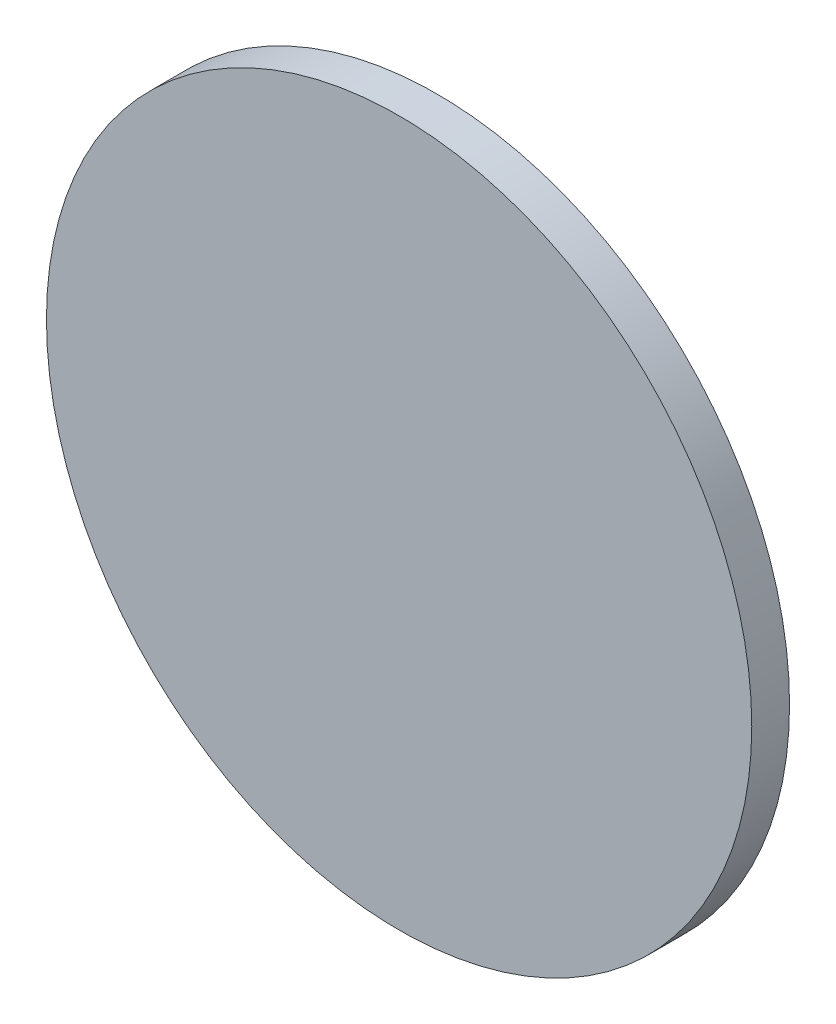
ISO-10303-21;
HEADER;
FILE_DESCRIPTION(('STEP AP214'),'2;1');
FILE_NAME('part.step','',(''),(''),'','','');
FILE_SCHEMA(('AUTOMOTIVE_DESIGN { 1 0 10303 214 1 1 1 1 }'));
ENDSEC;
DATA;
#1=APPLICATION_CONTEXT('core data for automotive mechanical design processes');
#2=APPLICATION_PROTOCOL_DEFINITION('international standard','automotive_design',2000,#1);
#3=PRODUCT_CONTEXT('',#1,'mechanical');
#4=PRODUCT('Part','Part','',(#3));
#5=PRODUCT_RELATED_PRODUCT_CATEGORY('part','',(#4));
#6=PRODUCT_DEFINITION_FORMATION('','',#4);
#7=PRODUCT_DEFINITION_CONTEXT('part definition',#1,'design');
#8=PRODUCT_DEFINITION('design','',#6,#7);
#9=PRODUCT_DEFINITION_SHAPE('','',#8);
#10=(LENGTH_UNIT() NAMED_UNIT(*) SI_UNIT(.MILLI.,.METRE.));
#11=(NAMED_UNIT(*) PLANE_ANGLE_UNIT() SI_UNIT($,.RADIAN.));
#12=(NAMED_UNIT(*) SI_UNIT($,.STERADIAN.) SOLID_ANGLE_UNIT());
#13=UNCERTAINTY_MEASURE_WITH_UNIT(LENGTH_MEASURE(1.E-05),#10,'distance_accuracy_value','');
#14=(GEOMETRIC_REPRESENTATION_CONTEXT(3) GLOBAL_UNCERTAINTY_ASSIGNED_CONTEXT((#13)) GLOBAL_UNIT_ASSIGNED_CONTEXT((#10,
#11,#12)) REPRESENTATION_CONTEXT('',''));
#15=CARTESIAN_POINT('',(0.,0.,0.));
#16=DIRECTION('',(0.,0.,1.));
#17=DIRECTION('',(1.,0.,0.));
#18=AXIS2_PLACEMENT_3D('',#15,#16,#17);
#19=CARTESIAN_POINT('',(0.,0.,19.05));
#20=DIRECTION('',(0.,0.,-1.));
#21=DIRECTION('',(-1.,0.,0.));
#22=AXIS2_PLACEMENT_3D('',#19,#20,#21);
#23=CYLINDRICAL_SURFACE('',#22,177.8);
#24=CARTESIAN_POINT('',(0.,0.,19.05));
#25=DIRECTION('',(0.,0.,1.));
#26=DIRECTION('',(1.,0.,0.));
#27=AXIS2_PLACEMENT_3D('',#24,#25,#26);
#28=CIRCLE('',#27,177.8);
#29=CARTESIAN_POINT('',(-177.8,0.,19.05));
#30=VERTEX_POINT('',#29);
#31=EDGE_CURVE('E10',#30,#30,#28,.T.);
#32=CARTESIAN_POINT('',(0.,0.,0.));
#33=DIRECTION('',(0.,0.,1.));
#34=DIRECTION('',(1.,0.,0.));
#35=AXIS2_PLACEMENT_3D('',#32,#33,#34);
#36=CIRCLE('',#35,177.8);
#37=CARTESIAN_POINT('',(-177.8,0.,0.));
#38=VERTEX_POINT('',#37);
#39=EDGE_CURVE('E35',#38,#38,#36,.T.);
#40=CARTESIAN_POINT('',(-177.8,0.,19.05));
#41=CARTESIAN_POINT('',(-177.8,0.,18.8515625));
#42=CARTESIAN_POINT('',(-177.8,0.,18.653125));
#43=CARTESIAN_POINT('',(-177.8,0.,18.25625));
#44=CARTESIAN_POINT('',(-177.8,0.,18.0578125));
#45=CARTESIAN_POINT('',(-177.8,0.,17.6609375));
#46=CARTESIAN_POINT('',(-177.8,0.,17.4625));
#47=CARTESIAN_POINT('',(-177.8,0.,17.065625));
#48=CARTESIAN_POINT('',(-177.8,0.,16.8671875));
#49=CARTESIAN_POINT('',(-177.8,0.,16.4703125));
#50=CARTESIAN_POINT('',(-177.8,0.,16.271875));
#51=CARTESIAN_POINT('',(-177.8,0.,15.875));
#52=CARTESIAN_POINT('',(-177.8,0.,15.6765625));
#53=CARTESIAN_POINT('',(-177.8,0.,15.2796875));
#54=CARTESIAN_POINT('',(-177.8,0.,15.08125));
#55=CARTESIAN_POINT('',(-177.8,0.,14.684375));
#56=CARTESIAN_POINT('',(-177.8,0.,14.4859375));
#57=CARTESIAN_POINT('',(-177.8,0.,14.0890625));
#58=CARTESIAN_POINT('',(-177.8,0.,13.890625));
#59=CARTESIAN_POINT('',(-177.8,0.,13.49375));
#60=CARTESIAN_POINT('',(-177.8,0.,13.2953125));
#61=CARTESIAN_POINT('',(-177.8,0.,12.8984375));
#62=CARTESIAN_POINT('',(-177.8,0.,12.7));
#63=CARTESIAN_POINT('',(-177.8,0.,12.303125));
#64=CARTESIAN_POINT('',(-177.8,0.,12.1046875));
#65=CARTESIAN_POINT('',(-177.8,0.,11.7078125));
#66=CARTESIAN_POINT('',(-177.8,0.,11.509375));
#67=CARTESIAN_POINT('',(-177.8,0.,11.1125));
#68=CARTESIAN_POINT('',(-177.8,0.,10.9140625));
#69=CARTESIAN_POINT('',(-177.8,0.,10.5171875));
#70=CARTESIAN_POINT('',(-177.8,0.,10.31875));
#71=CARTESIAN_POINT('',(-177.8,0.,9.921875));
#72=CARTESIAN_POINT('',(-177.8,0.,9.7234375));
#73=CARTESIAN_POINT('',(-177.8,0.,9.3265625));
#74=CARTESIAN_POINT('',(-177.8,0.,9.128125));
#75=CARTESIAN_POINT('',(-177.8,0.,8.73125));
#76=CARTESIAN_POINT('',(-177.8,0.,8.5328125));
#77=CARTESIAN_POINT('',(-177.8,0.,8.1359375));
#78=CARTESIAN_POINT('',(-177.8,0.,7.9375));
#79=CARTESIAN_POINT('',(-177.8,0.,7.540625));
#80=CARTESIAN_POINT('',(-177.8,0.,7.3421875));
#81=CARTESIAN_POINT('',(-177.8,0.,6.9453125));
#82=CARTESIAN_POINT('',(-177.8,0.,6.746875));
#83=CARTESIAN_POINT('',(-177.8,0.,6.35));
#84=CARTESIAN_POINT('',(-177.8,0.,6.1515625));
#85=CARTESIAN_POINT('',(-177.8,0.,5.7546875));
#86=CARTESIAN_POINT('',(-177.8,0.,5.55625));
#87=CARTESIAN_POINT('',(-177.8,0.,5.159375));
#88=CARTESIAN_POINT('',(-177.8,0.,4.9609375));
#89=CARTESIAN_POINT('',(-177.8,0.,4.5640625));
#90=CARTESIAN_POINT('',(-177.8,0.,4.365625));
#91=CARTESIAN_POINT('',(-177.8,0.,3.96875));
#92=CARTESIAN_POINT('',(-177.8,0.,3.7703125));
#93=CARTESIAN_POINT('',(-177.8,0.,3.3734375));
#94=CARTESIAN_POINT('',(-177.8,0.,3.175));
#95=CARTESIAN_POINT('',(-177.8,0.,2.778125));
#96=CARTESIAN_POINT('',(-177.8,0.,2.5796875));
#97=CARTESIAN_POINT('',(-177.8,0.,2.1828125));
#98=CARTESIAN_POINT('',(-177.8,0.,1.984375));
#99=CARTESIAN_POINT('',(-177.8,0.,1.5875));
#100=CARTESIAN_POINT('',(-177.8,0.,1.3890625));
#101=CARTESIAN_POINT('',(-177.8,0.,0.992187500000001));
#102=CARTESIAN_POINT('',(-177.8,0.,0.793750000000001));
#103=CARTESIAN_POINT('',(-177.8,0.,0.396875));
#104=CARTESIAN_POINT('',(-177.8,0.,0.1984375));
#105=CARTESIAN_POINT('',(-177.8,0.,0.));
#106=B_SPLINE_CURVE_WITH_KNOTS('',3,(#40,#41,#42,#43,#44,#45,#46,#47,#48,#49,#50,#51,#52,#53,
#54,#55,#56,#57,#58,#59,#60,#61,#62,#63,#64,#65,#66,#67,#68,#69,#70,#71,#72,#73,#74,#75,#76,#77,
#78,#79,#80,#81,#82,#83,#84,#85,#86,#87,#88,#89,#90,#91,#92,#93,#94,#95,#96,#97,#98,#99,#100,
#101,#102,#103,#104,#105),.UNSPECIFIED.,.F.,.F.,(4,2,2,2,2,2,2,2,2,2,2,2,2,2,2,2,2,2,2,2,2,2,2,
2,2,2,2,2,2,2,2,2,4),(0.,0.5953125,1.190625,1.7859375,2.38125,2.9765625,3.571875,4.1671875,
4.7625,5.3578125,5.953125,6.5484375,7.14375,7.7390625,8.334375,8.9296875,9.525,10.1203125,
10.715625,11.3109375,11.90625,12.5015625,13.096875,13.6921875,14.2875,14.8828125,15.478125,
16.0734375,16.66875,17.2640625,17.859375,18.4546875,19.05),.UNSPECIFIED.);
#107=EDGE_CURVE('BSEAM32',#30,#38,#106,.T.);
#108=ORIENTED_EDGE('',*,*,#31,.F.);
#109=ORIENTED_EDGE('',*,*,#39,.T.);
#110=ORIENTED_EDGE('',*,*,#107,.T.);
#111=ORIENTED_EDGE('',*,*,#107,.F.);
#112=EDGE_LOOP('',(#108,#110,#109,#111));
#113=FACE_BOUND('',#112,.T.);
#114=ADVANCED_FACE('F32',(#113),#23,.T.);
#115=CARTESIAN_POINT('',(0.,0.,19.05));
#116=DIRECTION('',(0.,0.,1.));
#117=DIRECTION('',(1.,0.,0.));
#118=AXIS2_PLACEMENT_3D('',#115,#116,#117);
#119=PLANE('',#118);
#120=ORIENTED_EDGE('',*,*,#31,.T.);
#121=EDGE_LOOP('',(#120));
#122=FACE_BOUND('',#121,.T.);
#123=ADVANCED_FACE('F47',(#122),#119,.T.);
#124=CARTESIAN_POINT('',(0.,0.,0.));
#125=DIRECTION('',(0.,0.,1.));
#126=DIRECTION('',(1.,0.,0.));
#127=AXIS2_PLACEMENT_3D('',#124,#125,#126);
#128=PLANE('',#127);
#129=ORIENTED_EDGE('',*,*,#39,.F.);
#130=EDGE_LOOP('',(#129));
#131=FACE_BOUND('',#130,.T.);
#132=ADVANCED_FACE('F45',(#131),#128,.F.);
#133=CLOSED_SHELL('',(#114,#123,#132));
#134=MANIFOLD_SOLID_BREP('B2',#133);
#135=ADVANCED_BREP_SHAPE_REPRESENTATION('',(#18,#134),#14);
#136=SHAPE_DEFINITION_REPRESENTATION(#9,#135);
ENDSEC;
END-ISO-10303-21;
